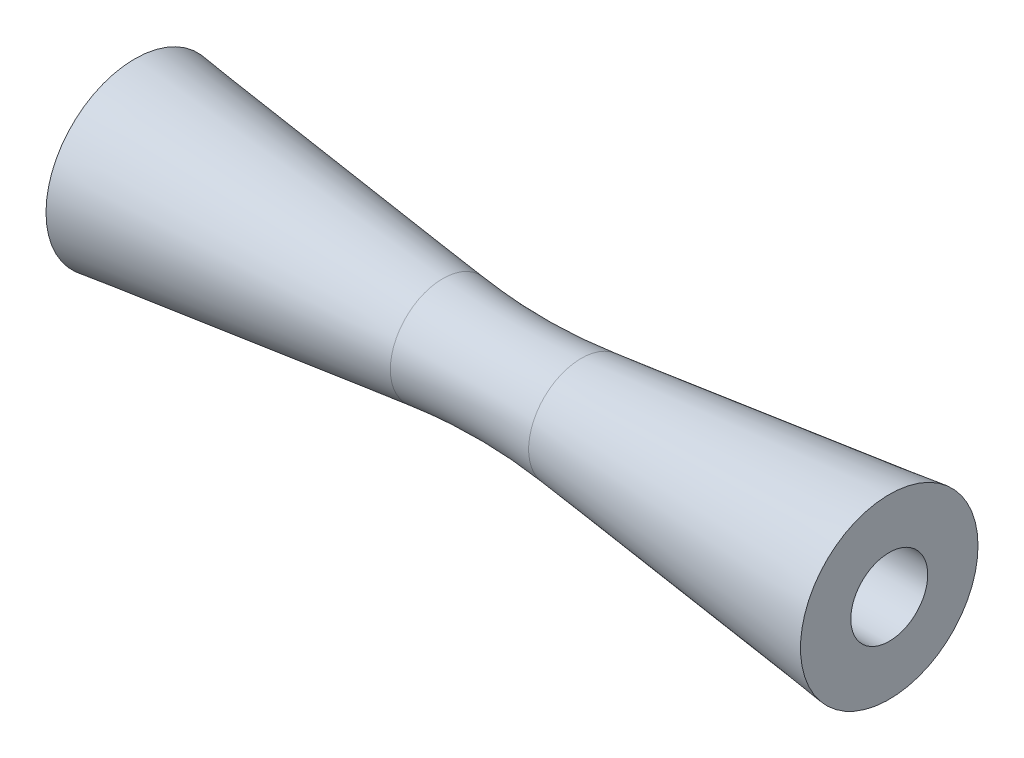
ISO-10303-21;
HEADER;
FILE_DESCRIPTION(('STEP AP214'),'2;1');
FILE_NAME('part.step','',(''),(''),'','','');
FILE_SCHEMA(('AUTOMOTIVE_DESIGN { 1 0 10303 214 1 1 1 1 }'));
ENDSEC;
DATA;
#1=APPLICATION_CONTEXT('core data for automotive mechanical design processes');
#2=APPLICATION_PROTOCOL_DEFINITION('international standard','automotive_design',2000,#1);
#3=PRODUCT_CONTEXT('',#1,'mechanical');
#4=PRODUCT('Part','Part','',(#3));
#5=PRODUCT_RELATED_PRODUCT_CATEGORY('part','',(#4));
#6=PRODUCT_DEFINITION_FORMATION('','',#4);
#7=PRODUCT_DEFINITION_CONTEXT('part definition',#1,'design');
#8=PRODUCT_DEFINITION('design','',#6,#7);
#9=PRODUCT_DEFINITION_SHAPE('','',#8);
#10=(LENGTH_UNIT() NAMED_UNIT(*) SI_UNIT(.MILLI.,.METRE.));
#11=(NAMED_UNIT(*) PLANE_ANGLE_UNIT() SI_UNIT($,.RADIAN.));
#12=(NAMED_UNIT(*) SI_UNIT($,.STERADIAN.) SOLID_ANGLE_UNIT());
#13=UNCERTAINTY_MEASURE_WITH_UNIT(LENGTH_MEASURE(1.E-05),#10,'distance_accuracy_value','');
#14=(GEOMETRIC_REPRESENTATION_CONTEXT(3) GLOBAL_UNCERTAINTY_ASSIGNED_CONTEXT((#13)) GLOBAL_UNIT_ASSIGNED_CONTEXT((#10,
#11,#12)) REPRESENTATION_CONTEXT('',''));
#15=CARTESIAN_POINT('',(0.,0.,0.));
#16=DIRECTION('',(0.,0.,1.));
#17=DIRECTION('',(1.,0.,0.));
#18=AXIS2_PLACEMENT_3D('',#15,#16,#17);
#19=CARTESIAN_POINT('',(0.,7.62,0.));
#20=DIRECTION('',(-1.,0.,0.));
#21=DIRECTION('',(0.,0.,1.));
#22=AXIS2_PLACEMENT_3D('',#19,#20,#21);
#23=PLANE('',#22);
#24=CARTESIAN_POINT('',(0.,0.,0.));
#25=DIRECTION('',(1.,0.,0.));
#26=DIRECTION('',(0.,0.,-1.));
#27=AXIS2_PLACEMENT_3D('',#24,#25,#26);
#28=CIRCLE('',#27,3.30199999999999);
#29=CARTESIAN_POINT('',(0.,0.,-3.30199999999999));
#30=VERTEX_POINT('',#29);
#31=EDGE_CURVE('E72',#30,#30,#28,.T.);
#32=ORIENTED_EDGE('',*,*,#31,.T.);
#33=EDGE_LOOP('',(#32));
#34=FACE_BOUND('',#33,.T.);
#35=CARTESIAN_POINT('',(0.,0.,0.));
#36=DIRECTION('',(1.,0.,0.));
#37=DIRECTION('',(0.,0.,-1.));
#38=AXIS2_PLACEMENT_3D('',#35,#36,#37);
#39=CIRCLE('',#38,7.62);
#40=CARTESIAN_POINT('',(0.,0.,-7.62));
#41=VERTEX_POINT('',#40);
#42=EDGE_CURVE('E57',#41,#41,#39,.T.);
#43=ORIENTED_EDGE('',*,*,#42,.F.);
#44=EDGE_LOOP('',(#43));
#45=FACE_BOUND('',#44,.T.);
#46=ADVANCED_FACE('F43',(#34,#45),#23,.T.);
#47=CARTESIAN_POINT('',(32.385,0.,0.));
#48=DIRECTION('',(-1.,0.,0.));
#49=DIRECTION('',(0.,0.,1.));
#50=AXIS2_PLACEMENT_3D('',#47,#48,#49);
#51=CONICAL_SURFACE('',#50,3.81,0.117108744566864);
#52=CARTESIAN_POINT('',(26.4494646235762,0.,0.));
#53=DIRECTION('',(-1.,0.,0.));
#54=DIRECTION('',(0.,0.,1.));
#55=AXIS2_PLACEMENT_3D('',#52,#53,#54);
#56=CIRCLE('',#55,4.50829827957927);
#57=CARTESIAN_POINT('',(26.4494646235762,0.,4.50829827957927));
#58=VERTEX_POINT('',#57);
#59=EDGE_CURVE('E10',#58,#58,#56,.T.);
#60=ORIENTED_EDGE('',*,*,#59,.T.);
#61=EDGE_LOOP('',(#60));
#62=FACE_BOUND('',#61,.T.);
#63=ORIENTED_EDGE('',*,*,#42,.T.);
#64=EDGE_LOOP('',(#63));
#65=FACE_BOUND('',#64,.T.);
#66=ADVANCED_FACE('F91',(#62,#65),#51,.T.);
#67=CARTESIAN_POINT('',(64.77,0.,0.));
#68=DIRECTION('',(1.,0.,0.));
#69=DIRECTION('',(0.,0.,-1.));
#70=AXIS2_PLACEMENT_3D('',#67,#68,#69);
#71=CONICAL_SURFACE('',#70,7.62,0.117108744566864);
#72=CARTESIAN_POINT('',(38.3205353764238,0.,0.));
#73=DIRECTION('',(1.,0.,0.));
#74=DIRECTION('',(0.,0.,-1.));
#75=AXIS2_PLACEMENT_3D('',#72,#73,#74);
#76=CIRCLE('',#75,4.50829827957927);
#77=CARTESIAN_POINT('',(38.3205353764238,0.,-4.50829827957927));
#78=VERTEX_POINT('',#77);
#79=EDGE_CURVE('E51',#78,#78,#76,.T.);
#80=ORIENTED_EDGE('',*,*,#79,.T.);
#81=EDGE_LOOP('',(#80));
#82=FACE_BOUND('',#81,.T.);
#83=CARTESIAN_POINT('',(64.77,0.,0.));
#84=DIRECTION('',(1.,0.,0.));
#85=DIRECTION('',(0.,0.,-1.));
#86=AXIS2_PLACEMENT_3D('',#83,#84,#85);
#87=CIRCLE('',#86,7.62);
#88=CARTESIAN_POINT('',(64.77,0.,-7.62));
#89=VERTEX_POINT('',#88);
#90=EDGE_CURVE('E62',#89,#89,#87,.T.);
#91=ORIENTED_EDGE('',*,*,#90,.F.);
#92=EDGE_LOOP('',(#91));
#93=FACE_BOUND('',#92,.T.);
#94=ADVANCED_FACE('F90',(#82,#93),#71,.T.);
#95=CARTESIAN_POINT('',(64.77,7.62,0.));
#96=DIRECTION('',(1.,0.,0.));
#97=DIRECTION('',(0.,0.,-1.));
#98=AXIS2_PLACEMENT_3D('',#95,#96,#97);
#99=PLANE('',#98);
#100=ORIENTED_EDGE('',*,*,#90,.T.);
#101=EDGE_LOOP('',(#100));
#102=FACE_BOUND('',#101,.T.);
#103=CARTESIAN_POINT('',(64.77,0.,0.));
#104=DIRECTION('',(1.,0.,0.));
#105=DIRECTION('',(0.,0.,-1.));
#106=AXIS2_PLACEMENT_3D('',#103,#104,#105);
#107=CIRCLE('',#106,3.302);
#108=CARTESIAN_POINT('',(64.77,0.,-3.302));
#109=VERTEX_POINT('',#108);
#110=EDGE_CURVE('E70',#109,#109,#107,.T.);
#111=ORIENTED_EDGE('',*,*,#110,.F.);
#112=EDGE_LOOP('',(#111));
#113=FACE_BOUND('',#112,.T.);
#114=ADVANCED_FACE('F78',(#102,#113),#99,.T.);
#115=CARTESIAN_POINT('',(64.77,0.,0.));
#116=DIRECTION('',(1.,0.,0.));
#117=DIRECTION('',(0.,0.,-1.));
#118=AXIS2_PLACEMENT_3D('',#115,#116,#117);
#119=CYLINDRICAL_SURFACE('',#118,3.302);
#120=ORIENTED_EDGE('',*,*,#110,.T.);
#121=EDGE_LOOP('',(#120));
#122=FACE_BOUND('',#121,.T.);
#123=ORIENTED_EDGE('',*,*,#31,.F.);
#124=EDGE_LOOP('',(#123));
#125=FACE_BOUND('',#124,.T.);
#126=ADVANCED_FACE('F79',(#122,#125),#119,.F.);
#127=CARTESIAN_POINT('',(32.385,0.,0.));
#128=DIRECTION('',(1.,0.,0.));
#129=DIRECTION('',(0.,0.,-1.));
#130=AXIS2_PLACEMENT_3D('',#127,#128,#129);
#131=TOROIDAL_SURFACE('',#130,54.9603489791814,50.8);
#132=ORIENTED_EDGE('',*,*,#59,.F.);
#133=EDGE_LOOP('',(#132));
#134=FACE_BOUND('',#133,.T.);
#135=ORIENTED_EDGE('',*,*,#79,.F.);
#136=EDGE_LOOP('',(#135));
#137=FACE_BOUND('',#136,.T.);
#138=ADVANCED_FACE('F44',(#134,#137),#131,.F.);
#139=CLOSED_SHELL('',(#46,#66,#94,#114,#126,#138));
#140=MANIFOLD_SOLID_BREP('B2',#139);
#141=ADVANCED_BREP_SHAPE_REPRESENTATION('',(#18,#140),#14);
#142=SHAPE_DEFINITION_REPRESENTATION(#9,#141);
ENDSEC;
END-ISO-10303-21;
